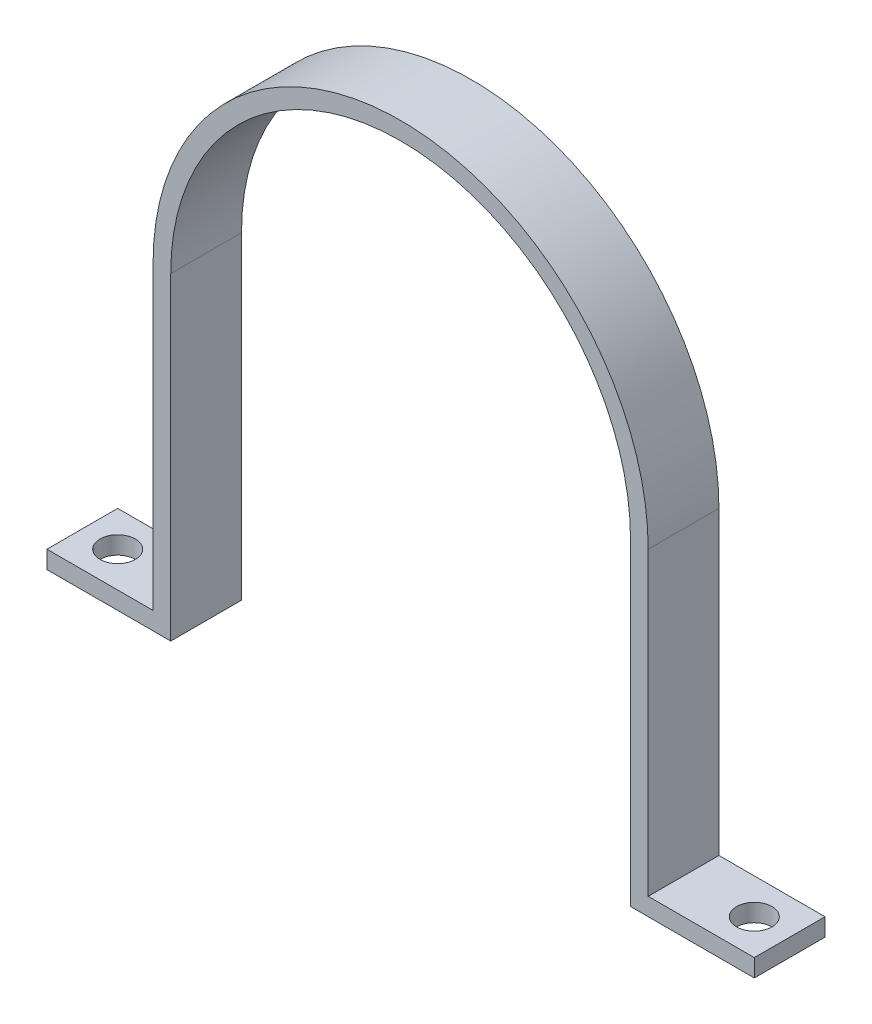
ISO-10303-21;
HEADER;
FILE_DESCRIPTION(('STEP AP214'),'2;1');
FILE_NAME('part.step','',(''),(''),'','','');
FILE_SCHEMA(('AUTOMOTIVE_DESIGN { 1 0 10303 214 1 1 1 1 }'));
ENDSEC;
DATA;
#1=APPLICATION_CONTEXT('core data for automotive mechanical design processes');
#2=APPLICATION_PROTOCOL_DEFINITION('international standard','automotive_design',2000,#1);
#3=PRODUCT_CONTEXT('',#1,'mechanical');
#4=PRODUCT('Part','Part','',(#3));
#5=PRODUCT_RELATED_PRODUCT_CATEGORY('part','',(#4));
#6=PRODUCT_DEFINITION_FORMATION('','',#4);
#7=PRODUCT_DEFINITION_CONTEXT('part definition',#1,'design');
#8=PRODUCT_DEFINITION('design','',#6,#7);
#9=PRODUCT_DEFINITION_SHAPE('','',#8);
#10=(LENGTH_UNIT() NAMED_UNIT(*) SI_UNIT(.MILLI.,.METRE.));
#11=(NAMED_UNIT(*) PLANE_ANGLE_UNIT() SI_UNIT($,.RADIAN.));
#12=(NAMED_UNIT(*) SI_UNIT($,.STERADIAN.) SOLID_ANGLE_UNIT());
#13=UNCERTAINTY_MEASURE_WITH_UNIT(LENGTH_MEASURE(1.E-05),#10,'distance_accuracy_value','');
#14=(GEOMETRIC_REPRESENTATION_CONTEXT(3) GLOBAL_UNCERTAINTY_ASSIGNED_CONTEXT((#13)) GLOBAL_UNIT_ASSIGNED_CONTEXT((#10,
#11,#12)) REPRESENTATION_CONTEXT('',''));
#15=CARTESIAN_POINT('',(0.,0.,0.));
#16=DIRECTION('',(0.,0.,1.));
#17=DIRECTION('',(1.,0.,0.));
#18=AXIS2_PLACEMENT_3D('',#15,#16,#17);
#19=CARTESIAN_POINT('',(28.,0.,8.));
#20=DIRECTION('',(1.,0.,0.));
#21=DIRECTION('',(0.,1.,0.));
#22=AXIS2_PLACEMENT_3D('',#19,#20,#21);
#23=PLANE('',#22);
#24=DIRECTION('',(0.,-1.,0.));
#25=VECTOR('',#24,1.);
#26=CARTESIAN_POINT('',(28.,0.,0.));
#27=LINE('',#26,#25);
#28=CARTESIAN_POINT('',(28.,0.,0.));
#29=VERTEX_POINT('',#28);
#30=CARTESIAN_POINT('',(28.,-34.,0.));
#31=VERTEX_POINT('',#30);
#32=EDGE_CURVE('E159',#29,#31,#27,.T.);
#33=ORIENTED_EDGE('',*,*,#32,.F.);
#34=DIRECTION('',(0.,0.,-1.));
#35=VECTOR('',#34,1.);
#36=CARTESIAN_POINT('',(28.,0.,8.));
#37=LINE('',#36,#35);
#38=CARTESIAN_POINT('',(28.,0.,8.));
#39=VERTEX_POINT('',#38);
#40=EDGE_CURVE('E11',#39,#29,#37,.T.);
#41=ORIENTED_EDGE('',*,*,#40,.F.);
#42=DIRECTION('',(0.,-1.,0.));
#43=VECTOR('',#42,1.);
#44=CARTESIAN_POINT('',(28.,0.,8.));
#45=LINE('',#44,#43);
#46=CARTESIAN_POINT('',(28.,-34.,8.));
#47=VERTEX_POINT('',#46);
#48=EDGE_CURVE('E191',#39,#47,#45,.T.);
#49=ORIENTED_EDGE('',*,*,#48,.T.);
#50=DIRECTION('',(0.,0.,-1.));
#51=VECTOR('',#50,1.);
#52=CARTESIAN_POINT('',(28.,-34.,8.));
#53=LINE('',#52,#51);
#54=EDGE_CURVE('E56',#47,#31,#53,.T.);
#55=ORIENTED_EDGE('',*,*,#54,.T.);
#56=EDGE_LOOP('',(#33,#41,#49,#55));
#57=FACE_BOUND('',#56,.T.);
#58=ADVANCED_FACE('F40',(#57),#23,.T.);
#59=CARTESIAN_POINT('',(0.,0.,8.));
#60=DIRECTION('',(0.,0.,-1.));
#61=DIRECTION('',(-1.,0.,0.));
#62=AXIS2_PLACEMENT_3D('',#59,#60,#61);
#63=CYLINDRICAL_SURFACE('',#62,28.);
#64=CARTESIAN_POINT('',(0.,0.,0.));
#65=DIRECTION('',(0.,0.,1.));
#66=DIRECTION('',(1.,0.,0.));
#67=AXIS2_PLACEMENT_3D('',#64,#65,#66);
#68=CIRCLE('',#67,28.);
#69=CARTESIAN_POINT('',(-28.,0.,0.));
#70=VERTEX_POINT('',#69);
#71=EDGE_CURVE('E161',#29,#70,#68,.T.);
#72=ORIENTED_EDGE('',*,*,#71,.T.);
#73=DIRECTION('',(0.,0.,-1.));
#74=VECTOR('',#73,1.);
#75=CARTESIAN_POINT('',(-28.,0.,8.));
#76=LINE('',#75,#74);
#77=CARTESIAN_POINT('',(-28.,0.,8.));
#78=VERTEX_POINT('',#77);
#79=EDGE_CURVE('E48',#78,#70,#76,.T.);
#80=ORIENTED_EDGE('',*,*,#79,.F.);
#81=CARTESIAN_POINT('',(0.,0.,8.));
#82=DIRECTION('',(0.,0.,1.));
#83=DIRECTION('',(1.,0.,0.));
#84=AXIS2_PLACEMENT_3D('',#81,#82,#83);
#85=CIRCLE('',#84,28.);
#86=EDGE_CURVE('E226',#39,#78,#85,.T.);
#87=ORIENTED_EDGE('',*,*,#86,.F.);
#88=ORIENTED_EDGE('',*,*,#40,.T.);
#89=EDGE_LOOP('',(#72,#80,#87,#88));
#90=FACE_BOUND('',#89,.T.);
#91=ADVANCED_FACE('F215',(#90),#63,.T.);
#92=CARTESIAN_POINT('',(-28.,0.,8.));
#93=DIRECTION('',(-1.,0.,0.));
#94=DIRECTION('',(0.,-1.,0.));
#95=AXIS2_PLACEMENT_3D('',#92,#93,#94);
#96=PLANE('',#95);
#97=DIRECTION('',(0.,1.,0.));
#98=VECTOR('',#97,1.);
#99=CARTESIAN_POINT('',(-28.,0.,0.));
#100=LINE('',#99,#98);
#101=CARTESIAN_POINT('',(-28.,-34.,0.));
#102=VERTEX_POINT('',#101);
#103=EDGE_CURVE('E165',#102,#70,#100,.T.);
#104=ORIENTED_EDGE('',*,*,#103,.F.);
#105=DIRECTION('',(0.,0.,-1.));
#106=VECTOR('',#105,1.);
#107=CARTESIAN_POINT('',(-28.,-34.,8.));
#108=LINE('',#107,#106);
#109=CARTESIAN_POINT('',(-28.,-34.,8.));
#110=VERTEX_POINT('',#109);
#111=EDGE_CURVE('E205',#110,#102,#108,.T.);
#112=ORIENTED_EDGE('',*,*,#111,.F.);
#113=DIRECTION('',(0.,1.,0.));
#114=VECTOR('',#113,1.);
#115=CARTESIAN_POINT('',(-28.,0.,8.));
#116=LINE('',#115,#114);
#117=EDGE_CURVE('E212',#110,#78,#116,.T.);
#118=ORIENTED_EDGE('',*,*,#117,.T.);
#119=ORIENTED_EDGE('',*,*,#79,.T.);
#120=EDGE_LOOP('',(#104,#112,#118,#119));
#121=FACE_BOUND('',#120,.T.);
#122=ADVANCED_FACE('F210',(#121),#96,.T.);
#123=CARTESIAN_POINT('',(0.,-34.,8.));
#124=DIRECTION('',(0.,1.,0.));
#125=DIRECTION('',(0.,0.,1.));
#126=AXIS2_PLACEMENT_3D('',#123,#124,#125);
#127=PLANE('',#126);
#128=CARTESIAN_POINT('',(-36.,-34.,4.));
#129=DIRECTION('',(0.,1.,0.));
#130=DIRECTION('',(0.,0.,1.));
#131=AXIS2_PLACEMENT_3D('',#128,#129,#130);
#132=CIRCLE('',#131,2.);
#133=CARTESIAN_POINT('',(-36.,-34.,6.));
#134=VERTEX_POINT('',#133);
#135=EDGE_CURVE('E295',#134,#134,#132,.T.);
#136=ORIENTED_EDGE('',*,*,#135,.F.);
#137=EDGE_LOOP('',(#136));
#138=FACE_BOUND('',#137,.T.);
#139=DIRECTION('',(1.,0.,0.));
#140=VECTOR('',#139,1.);
#141=CARTESIAN_POINT('',(0.,-34.,0.));
#142=LINE('',#141,#140);
#143=CARTESIAN_POINT('',(-40.,-34.,0.));
#144=VERTEX_POINT('',#143);
#145=EDGE_CURVE('E168',#144,#102,#142,.T.);
#146=ORIENTED_EDGE('',*,*,#145,.F.);
#147=DIRECTION('',(0.,0.,-1.));
#148=VECTOR('',#147,1.);
#149=CARTESIAN_POINT('',(-40.,-34.,8.));
#150=LINE('',#149,#148);
#151=CARTESIAN_POINT('',(-40.,-34.,8.));
#152=VERTEX_POINT('',#151);
#153=EDGE_CURVE('E203',#152,#144,#150,.T.);
#154=ORIENTED_EDGE('',*,*,#153,.F.);
#155=DIRECTION('',(1.,0.,0.));
#156=VECTOR('',#155,1.);
#157=CARTESIAN_POINT('',(0.,-34.,8.));
#158=LINE('',#157,#156);
#159=EDGE_CURVE('E225',#152,#110,#158,.T.);
#160=ORIENTED_EDGE('',*,*,#159,.T.);
#161=ORIENTED_EDGE('',*,*,#111,.T.);
#162=EDGE_LOOP('',(#146,#154,#160,#161));
#163=FACE_BOUND('',#162,.T.);
#164=ADVANCED_FACE('F221',(#138,#163),#127,.T.);
#165=CARTESIAN_POINT('',(-40.,0.,8.));
#166=DIRECTION('',(1.,0.,0.));
#167=DIRECTION('',(0.,0.,-1.));
#168=AXIS2_PLACEMENT_3D('',#165,#166,#167);
#169=PLANE('',#168);
#170=DIRECTION('',(0.,-1.,0.));
#171=VECTOR('',#170,1.);
#172=CARTESIAN_POINT('',(-40.,0.,0.));
#173=LINE('',#172,#171);
#174=CARTESIAN_POINT('',(-40.,-36.,0.));
#175=VERTEX_POINT('',#174);
#176=EDGE_CURVE('E171',#144,#175,#173,.T.);
#177=ORIENTED_EDGE('',*,*,#176,.T.);
#178=DIRECTION('',(0.,0.,-1.));
#179=VECTOR('',#178,1.);
#180=CARTESIAN_POINT('',(-40.,-36.,8.));
#181=LINE('',#180,#179);
#182=CARTESIAN_POINT('',(-40.,-36.,8.));
#183=VERTEX_POINT('',#182);
#184=EDGE_CURVE('E201',#183,#175,#181,.T.);
#185=ORIENTED_EDGE('',*,*,#184,.F.);
#186=DIRECTION('',(0.,-1.,0.));
#187=VECTOR('',#186,1.);
#188=CARTESIAN_POINT('',(-40.,0.,8.));
#189=LINE('',#188,#187);
#190=EDGE_CURVE('E228',#152,#183,#189,.T.);
#191=ORIENTED_EDGE('',*,*,#190,.F.);
#192=ORIENTED_EDGE('',*,*,#153,.T.);
#193=EDGE_LOOP('',(#177,#185,#191,#192));
#194=FACE_BOUND('',#193,.T.);
#195=ADVANCED_FACE('F311',(#194),#169,.F.);
#196=CARTESIAN_POINT('',(0.,-36.,8.));
#197=DIRECTION('',(0.,-1.,0.));
#198=DIRECTION('',(1.,0.,0.));
#199=AXIS2_PLACEMENT_3D('',#196,#197,#198);
#200=PLANE('',#199);
#201=CARTESIAN_POINT('',(-36.,-36.,4.));
#202=DIRECTION('',(0.,1.,0.));
#203=DIRECTION('',(0.,0.,1.));
#204=AXIS2_PLACEMENT_3D('',#201,#202,#203);
#205=CIRCLE('',#204,2.);
#206=CARTESIAN_POINT('',(-36.,-36.,6.));
#207=VERTEX_POINT('',#206);
#208=EDGE_CURVE('E162',#207,#207,#205,.T.);
#209=ORIENTED_EDGE('',*,*,#208,.T.);
#210=EDGE_LOOP('',(#209));
#211=FACE_BOUND('',#210,.T.);
#212=DIRECTION('',(-1.,0.,0.));
#213=VECTOR('',#212,1.);
#214=CARTESIAN_POINT('',(0.,-36.,0.));
#215=LINE('',#214,#213);
#216=CARTESIAN_POINT('',(-26.,-36.,0.));
#217=VERTEX_POINT('',#216);
#218=EDGE_CURVE('E174',#217,#175,#215,.T.);
#219=ORIENTED_EDGE('',*,*,#218,.F.);
#220=DIRECTION('',(0.,0.,-1.));
#221=VECTOR('',#220,1.);
#222=CARTESIAN_POINT('',(-26.,-36.,8.));
#223=LINE('',#222,#221);
#224=CARTESIAN_POINT('',(-26.,-36.,8.));
#225=VERTEX_POINT('',#224);
#226=EDGE_CURVE('E199',#225,#217,#223,.T.);
#227=ORIENTED_EDGE('',*,*,#226,.F.);
#228=DIRECTION('',(-1.,0.,0.));
#229=VECTOR('',#228,1.);
#230=CARTESIAN_POINT('',(0.,-36.,8.));
#231=LINE('',#230,#229);
#232=EDGE_CURVE('E234',#225,#183,#231,.T.);
#233=ORIENTED_EDGE('',*,*,#232,.T.);
#234=ORIENTED_EDGE('',*,*,#184,.T.);
#235=EDGE_LOOP('',(#219,#227,#233,#234));
#236=FACE_BOUND('',#235,.T.);
#237=ADVANCED_FACE('F308',(#211,#236),#200,.T.);
#238=CARTESIAN_POINT('',(-26.,0.,8.));
#239=DIRECTION('',(1.,0.,0.));
#240=DIRECTION('',(0.,1.,0.));
#241=AXIS2_PLACEMENT_3D('',#238,#239,#240);
#242=PLANE('',#241);
#243=DIRECTION('',(0.,-1.,0.));
#244=VECTOR('',#243,1.);
#245=CARTESIAN_POINT('',(-26.,0.,0.));
#246=LINE('',#245,#244);
#247=CARTESIAN_POINT('',(-26.,0.,0.));
#248=VERTEX_POINT('',#247);
#249=EDGE_CURVE('E177',#248,#217,#246,.T.);
#250=ORIENTED_EDGE('',*,*,#249,.F.);
#251=DIRECTION('',(0.,0.,-1.));
#252=VECTOR('',#251,1.);
#253=CARTESIAN_POINT('',(-26.,0.,8.));
#254=LINE('',#253,#252);
#255=CARTESIAN_POINT('',(-26.,0.,8.));
#256=VERTEX_POINT('',#255);
#257=EDGE_CURVE('E197',#256,#248,#254,.T.);
#258=ORIENTED_EDGE('',*,*,#257,.F.);
#259=DIRECTION('',(0.,-1.,0.));
#260=VECTOR('',#259,1.);
#261=CARTESIAN_POINT('',(-26.,0.,8.));
#262=LINE('',#261,#260);
#263=EDGE_CURVE('E237',#256,#225,#262,.T.);
#264=ORIENTED_EDGE('',*,*,#263,.T.);
#265=ORIENTED_EDGE('',*,*,#226,.T.);
#266=EDGE_LOOP('',(#250,#258,#264,#265));
#267=FACE_BOUND('',#266,.T.);
#268=ADVANCED_FACE('F249',(#267),#242,.T.);
#269=CARTESIAN_POINT('',(0.,0.,8.));
#270=DIRECTION('',(0.,0.,-1.));
#271=DIRECTION('',(-1.,0.,0.));
#272=AXIS2_PLACEMENT_3D('',#269,#270,#271);
#273=CYLINDRICAL_SURFACE('',#272,26.);
#274=CARTESIAN_POINT('',(0.,0.,0.));
#275=DIRECTION('',(0.,0.,1.));
#276=DIRECTION('',(1.,0.,0.));
#277=AXIS2_PLACEMENT_3D('',#274,#275,#276);
#278=CIRCLE('',#277,26.);
#279=CARTESIAN_POINT('',(26.,0.,0.));
#280=VERTEX_POINT('',#279);
#281=EDGE_CURVE('E180',#280,#248,#278,.T.);
#282=ORIENTED_EDGE('',*,*,#281,.F.);
#283=DIRECTION('',(0.,0.,-1.));
#284=VECTOR('',#283,1.);
#285=CARTESIAN_POINT('',(26.,0.,8.));
#286=LINE('',#285,#284);
#287=CARTESIAN_POINT('',(26.,0.,8.));
#288=VERTEX_POINT('',#287);
#289=EDGE_CURVE('E195',#288,#280,#286,.T.);
#290=ORIENTED_EDGE('',*,*,#289,.F.);
#291=CARTESIAN_POINT('',(0.,0.,8.));
#292=DIRECTION('',(0.,0.,1.));
#293=DIRECTION('',(1.,0.,0.));
#294=AXIS2_PLACEMENT_3D('',#291,#292,#293);
#295=CIRCLE('',#294,26.);
#296=EDGE_CURVE('E240',#288,#256,#295,.T.);
#297=ORIENTED_EDGE('',*,*,#296,.T.);
#298=ORIENTED_EDGE('',*,*,#257,.T.);
#299=EDGE_LOOP('',(#282,#290,#297,#298));
#300=FACE_BOUND('',#299,.T.);
#301=ADVANCED_FACE('F244',(#300),#273,.F.);
#302=CARTESIAN_POINT('',(26.,0.,8.));
#303=DIRECTION('',(1.,0.,0.));
#304=DIRECTION('',(0.,1.,0.));
#305=AXIS2_PLACEMENT_3D('',#302,#303,#304);
#306=PLANE('',#305);
#307=DIRECTION('',(0.,-1.,0.));
#308=VECTOR('',#307,1.);
#309=CARTESIAN_POINT('',(26.,0.,0.));
#310=LINE('',#309,#308);
#311=CARTESIAN_POINT('',(26.,-36.,0.));
#312=VERTEX_POINT('',#311);
#313=EDGE_CURVE('E183',#280,#312,#310,.T.);
#314=ORIENTED_EDGE('',*,*,#313,.T.);
#315=DIRECTION('',(0.,0.,-1.));
#316=VECTOR('',#315,1.);
#317=CARTESIAN_POINT('',(26.,-36.,8.));
#318=LINE('',#317,#316);
#319=CARTESIAN_POINT('',(26.,-36.,8.));
#320=VERTEX_POINT('',#319);
#321=EDGE_CURVE('E151',#320,#312,#318,.T.);
#322=ORIENTED_EDGE('',*,*,#321,.F.);
#323=DIRECTION('',(0.,-1.,0.));
#324=VECTOR('',#323,1.);
#325=CARTESIAN_POINT('',(26.,0.,8.));
#326=LINE('',#325,#324);
#327=EDGE_CURVE('E139',#288,#320,#326,.T.);
#328=ORIENTED_EDGE('',*,*,#327,.F.);
#329=ORIENTED_EDGE('',*,*,#289,.T.);
#330=EDGE_LOOP('',(#314,#322,#328,#329));
#331=FACE_BOUND('',#330,.T.);
#332=ADVANCED_FACE('F253',(#331),#306,.F.);
#333=CARTESIAN_POINT('',(0.,-36.,8.));
#334=DIRECTION('',(0.,1.,0.));
#335=DIRECTION('',(-1.,0.,0.));
#336=AXIS2_PLACEMENT_3D('',#333,#334,#335);
#337=PLANE('',#336);
#338=CARTESIAN_POINT('',(36.,-36.,4.));
#339=DIRECTION('',(0.,1.,0.));
#340=DIRECTION('',(0.,0.,1.));
#341=AXIS2_PLACEMENT_3D('',#338,#339,#340);
#342=CIRCLE('',#341,2.);
#343=CARTESIAN_POINT('',(36.,-36.,6.));
#344=VERTEX_POINT('',#343);
#345=EDGE_CURVE('E301',#344,#344,#342,.T.);
#346=ORIENTED_EDGE('',*,*,#345,.T.);
#347=EDGE_LOOP('',(#346));
#348=FACE_BOUND('',#347,.T.);
#349=DIRECTION('',(1.,0.,0.));
#350=VECTOR('',#349,1.);
#351=CARTESIAN_POINT('',(0.,-36.,0.));
#352=LINE('',#351,#350);
#353=CARTESIAN_POINT('',(40.,-36.,0.));
#354=VERTEX_POINT('',#353);
#355=EDGE_CURVE('E148',#312,#354,#352,.T.);
#356=ORIENTED_EDGE('',*,*,#355,.T.);
#357=DIRECTION('',(0.,0.,-1.));
#358=VECTOR('',#357,1.);
#359=CARTESIAN_POINT('',(40.,-36.,8.));
#360=LINE('',#359,#358);
#361=CARTESIAN_POINT('',(40.,-36.,8.));
#362=VERTEX_POINT('',#361);
#363=EDGE_CURVE('E145',#362,#354,#360,.T.);
#364=ORIENTED_EDGE('',*,*,#363,.F.);
#365=DIRECTION('',(1.,0.,0.));
#366=VECTOR('',#365,1.);
#367=CARTESIAN_POINT('',(0.,-36.,8.));
#368=LINE('',#367,#366);
#369=EDGE_CURVE('E130',#320,#362,#368,.T.);
#370=ORIENTED_EDGE('',*,*,#369,.F.);
#371=ORIENTED_EDGE('',*,*,#321,.T.);
#372=EDGE_LOOP('',(#356,#364,#370,#371));
#373=FACE_BOUND('',#372,.T.);
#374=ADVANCED_FACE('F146',(#348,#373),#337,.F.);
#375=CARTESIAN_POINT('',(40.,0.,8.));
#376=DIRECTION('',(1.,0.,0.));
#377=DIRECTION('',(0.,0.,-1.));
#378=AXIS2_PLACEMENT_3D('',#375,#376,#377);
#379=PLANE('',#378);
#380=DIRECTION('',(0.,-1.,0.));
#381=VECTOR('',#380,1.);
#382=CARTESIAN_POINT('',(40.,0.,0.));
#383=LINE('',#382,#381);
#384=CARTESIAN_POINT('',(40.,-34.,0.));
#385=VERTEX_POINT('',#384);
#386=EDGE_CURVE('E186',#385,#354,#383,.T.);
#387=ORIENTED_EDGE('',*,*,#386,.F.);
#388=DIRECTION('',(0.,0.,-1.));
#389=VECTOR('',#388,1.);
#390=CARTESIAN_POINT('',(40.,-34.,8.));
#391=LINE('',#390,#389);
#392=CARTESIAN_POINT('',(40.,-34.,8.));
#393=VERTEX_POINT('',#392);
#394=EDGE_CURVE('E93',#393,#385,#391,.T.);
#395=ORIENTED_EDGE('',*,*,#394,.F.);
#396=DIRECTION('',(0.,-1.,0.));
#397=VECTOR('',#396,1.);
#398=CARTESIAN_POINT('',(40.,0.,8.));
#399=LINE('',#398,#397);
#400=EDGE_CURVE('E136',#393,#362,#399,.T.);
#401=ORIENTED_EDGE('',*,*,#400,.T.);
#402=ORIENTED_EDGE('',*,*,#363,.T.);
#403=EDGE_LOOP('',(#387,#395,#401,#402));
#404=FACE_BOUND('',#403,.T.);
#405=ADVANCED_FACE('F153',(#404),#379,.T.);
#406=CARTESIAN_POINT('',(0.,-34.,8.));
#407=DIRECTION('',(0.,1.,0.));
#408=DIRECTION('',(0.,0.,1.));
#409=AXIS2_PLACEMENT_3D('',#406,#407,#408);
#410=PLANE('',#409);
#411=CARTESIAN_POINT('',(36.,-34.,4.));
#412=DIRECTION('',(0.,1.,0.));
#413=DIRECTION('',(0.,0.,1.));
#414=AXIS2_PLACEMENT_3D('',#411,#412,#413);
#415=CIRCLE('',#414,2.);
#416=CARTESIAN_POINT('',(36.,-34.,6.));
#417=VERTEX_POINT('',#416);
#418=EDGE_CURVE('E297',#417,#417,#415,.T.);
#419=ORIENTED_EDGE('',*,*,#418,.F.);
#420=EDGE_LOOP('',(#419));
#421=FACE_BOUND('',#420,.T.);
#422=DIRECTION('',(1.,0.,0.));
#423=VECTOR('',#422,1.);
#424=CARTESIAN_POINT('',(0.,-34.,0.));
#425=LINE('',#424,#423);
#426=EDGE_CURVE('E188',#31,#385,#425,.T.);
#427=ORIENTED_EDGE('',*,*,#426,.F.);
#428=ORIENTED_EDGE('',*,*,#54,.F.);
#429=DIRECTION('',(1.,0.,0.));
#430=VECTOR('',#429,1.);
#431=CARTESIAN_POINT('',(0.,-34.,8.));
#432=LINE('',#431,#430);
#433=EDGE_CURVE('E154',#47,#393,#432,.T.);
#434=ORIENTED_EDGE('',*,*,#433,.T.);
#435=ORIENTED_EDGE('',*,*,#394,.T.);
#436=EDGE_LOOP('',(#427,#428,#434,#435));
#437=FACE_BOUND('',#436,.T.);
#438=ADVANCED_FACE('F267',(#421,#437),#410,.T.);
#439=CARTESIAN_POINT('',(0.,0.,8.));
#440=DIRECTION('',(0.,0.,1.));
#441=DIRECTION('',(1.,0.,0.));
#442=AXIS2_PLACEMENT_3D('',#439,#440,#441);
#443=PLANE('',#442);
#444=ORIENTED_EDGE('',*,*,#48,.F.);
#445=ORIENTED_EDGE('',*,*,#86,.T.);
#446=ORIENTED_EDGE('',*,*,#117,.F.);
#447=ORIENTED_EDGE('',*,*,#159,.F.);
#448=ORIENTED_EDGE('',*,*,#190,.T.);
#449=ORIENTED_EDGE('',*,*,#232,.F.);
#450=ORIENTED_EDGE('',*,*,#263,.F.);
#451=ORIENTED_EDGE('',*,*,#296,.F.);
#452=ORIENTED_EDGE('',*,*,#327,.T.);
#453=ORIENTED_EDGE('',*,*,#369,.T.);
#454=ORIENTED_EDGE('',*,*,#400,.F.);
#455=ORIENTED_EDGE('',*,*,#433,.F.);
#456=EDGE_LOOP('',(#444,#445,#446,#447,#448,#449,#450,#451,#452,#453,#454,#455));
#457=FACE_BOUND('',#456,.T.);
#458=ADVANCED_FACE('F133',(#457),#443,.T.);
#459=CARTESIAN_POINT('',(0.,0.,0.));
#460=DIRECTION('',(0.,0.,1.));
#461=DIRECTION('',(1.,0.,0.));
#462=AXIS2_PLACEMENT_3D('',#459,#460,#461);
#463=PLANE('',#462);
#464=ORIENTED_EDGE('',*,*,#32,.T.);
#465=ORIENTED_EDGE('',*,*,#426,.T.);
#466=ORIENTED_EDGE('',*,*,#386,.T.);
#467=ORIENTED_EDGE('',*,*,#355,.F.);
#468=ORIENTED_EDGE('',*,*,#313,.F.);
#469=ORIENTED_EDGE('',*,*,#281,.T.);
#470=ORIENTED_EDGE('',*,*,#249,.T.);
#471=ORIENTED_EDGE('',*,*,#218,.T.);
#472=ORIENTED_EDGE('',*,*,#176,.F.);
#473=ORIENTED_EDGE('',*,*,#145,.T.);
#474=ORIENTED_EDGE('',*,*,#103,.T.);
#475=ORIENTED_EDGE('',*,*,#71,.F.);
#476=EDGE_LOOP('',(#464,#465,#466,#467,#468,#469,#470,#471,#472,#473,#474,#475));
#477=FACE_BOUND('',#476,.T.);
#478=ADVANCED_FACE('F217',(#477),#463,.F.);
#479=CARTESIAN_POINT('',(36.,-36.,4.));
#480=DIRECTION('',(0.,1.,0.));
#481=DIRECTION('',(0.,0.,1.));
#482=AXIS2_PLACEMENT_3D('',#479,#480,#481);
#483=CYLINDRICAL_SURFACE('',#482,2.);
#484=ORIENTED_EDGE('',*,*,#345,.F.);
#485=EDGE_LOOP('',(#484));
#486=FACE_BOUND('',#485,.T.);
#487=ORIENTED_EDGE('',*,*,#418,.T.);
#488=EDGE_LOOP('',(#487));
#489=FACE_BOUND('',#488,.T.);
#490=ADVANCED_FACE('F280',(#486,#489),#483,.F.);
#491=CARTESIAN_POINT('',(-36.,-36.,4.));
#492=DIRECTION('',(0.,1.,0.));
#493=DIRECTION('',(0.,0.,1.));
#494=AXIS2_PLACEMENT_3D('',#491,#492,#493);
#495=CYLINDRICAL_SURFACE('',#494,2.);
#496=ORIENTED_EDGE('',*,*,#208,.F.);
#497=EDGE_LOOP('',(#496));
#498=FACE_BOUND('',#497,.T.);
#499=ORIENTED_EDGE('',*,*,#135,.T.);
#500=EDGE_LOOP('',(#499));
#501=FACE_BOUND('',#500,.T.);
#502=ADVANCED_FACE('F284',(#498,#501),#495,.F.);
#503=CLOSED_SHELL('',(#58,#91,#122,#164,#195,#237,#268,#301,#332,#374,#405,#438,#458,#478,#490,#502));
#504=MANIFOLD_SOLID_BREP('B2',#503);
#505=ADVANCED_BREP_SHAPE_REPRESENTATION('',(#18,#504),#14);
#506=SHAPE_DEFINITION_REPRESENTATION(#9,#505);
ENDSEC;
END-ISO-10303-21;
